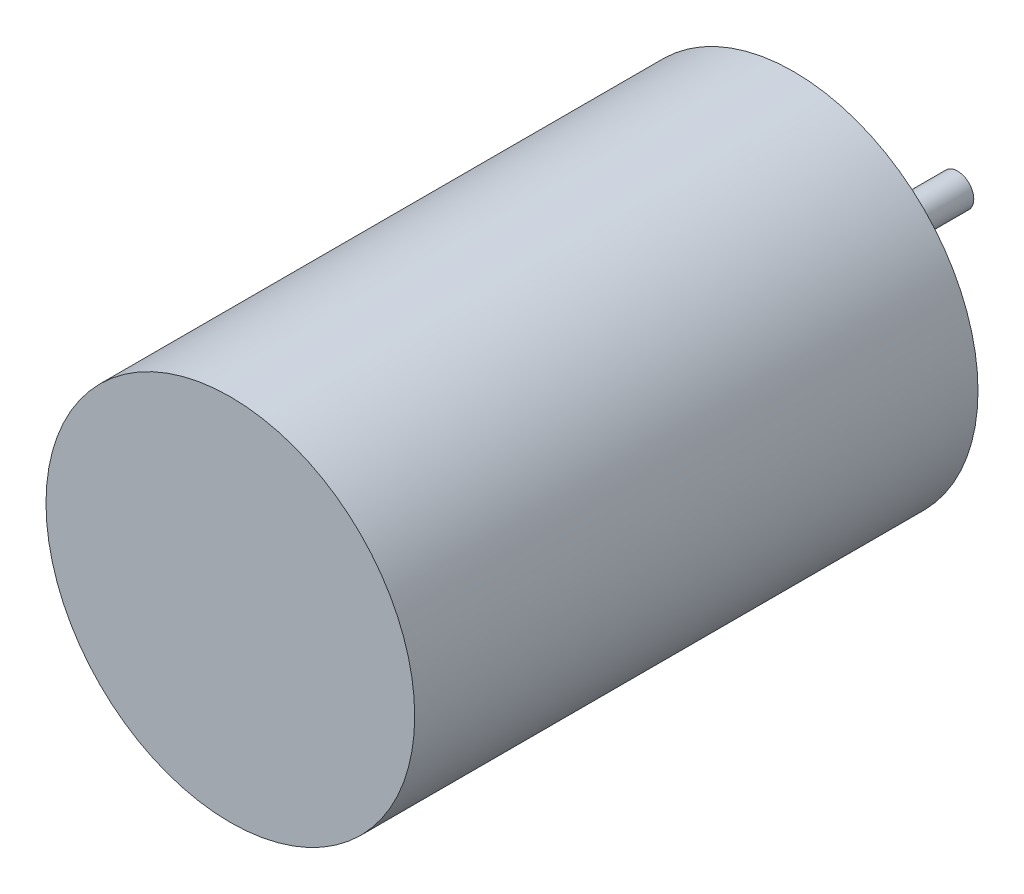
ISO-10303-21;
HEADER;
FILE_DESCRIPTION(('STEP AP214'),'2;1');
FILE_NAME('part.step','',(''),(''),'','','');
FILE_SCHEMA(('AUTOMOTIVE_DESIGN { 1 0 10303 214 1 1 1 1 }'));
ENDSEC;
DATA;
#1=APPLICATION_CONTEXT('core data for automotive mechanical design processes');
#2=APPLICATION_PROTOCOL_DEFINITION('international standard','automotive_design',2000,#1);
#3=PRODUCT_CONTEXT('',#1,'mechanical');
#4=PRODUCT('Part','Part','',(#3));
#5=PRODUCT_RELATED_PRODUCT_CATEGORY('part','',(#4));
#6=PRODUCT_DEFINITION_FORMATION('','',#4);
#7=PRODUCT_DEFINITION_CONTEXT('part definition',#1,'design');
#8=PRODUCT_DEFINITION('design','',#6,#7);
#9=PRODUCT_DEFINITION_SHAPE('','',#8);
#10=(LENGTH_UNIT() NAMED_UNIT(*) SI_UNIT(.MILLI.,.METRE.));
#11=(NAMED_UNIT(*) PLANE_ANGLE_UNIT() SI_UNIT($,.RADIAN.));
#12=(NAMED_UNIT(*) SI_UNIT($,.STERADIAN.) SOLID_ANGLE_UNIT());
#13=UNCERTAINTY_MEASURE_WITH_UNIT(LENGTH_MEASURE(1.E-05),#10,'distance_accuracy_value','');
#14=(GEOMETRIC_REPRESENTATION_CONTEXT(3) GLOBAL_UNCERTAINTY_ASSIGNED_CONTEXT((#13)) GLOBAL_UNIT_ASSIGNED_CONTEXT((#10,
#11,#12)) REPRESENTATION_CONTEXT('',''));
#15=CARTESIAN_POINT('',(0.,0.,0.));
#16=DIRECTION('',(0.,0.,1.));
#17=DIRECTION('',(1.,0.,0.));
#18=AXIS2_PLACEMENT_3D('',#15,#16,#17);
#19=CARTESIAN_POINT('',(0.,0.,0.));
#20=DIRECTION('',(0.,0.,1.));
#21=DIRECTION('',(1.,0.,0.));
#22=AXIS2_PLACEMENT_3D('',#19,#20,#21);
#23=PLANE('',#22);
#24=CARTESIAN_POINT('',(0.,0.,0.));
#25=DIRECTION('',(0.,0.,1.));
#26=DIRECTION('',(1.,0.,0.));
#27=AXIS2_PLACEMENT_3D('',#24,#25,#26);
#28=CIRCLE('',#27,18.);
#29=CARTESIAN_POINT('',(18.,0.,0.));
#30=VERTEX_POINT('',#29);
#31=EDGE_CURVE('E42',#30,#30,#28,.T.);
#32=ORIENTED_EDGE('',*,*,#31,.F.);
#33=EDGE_LOOP('',(#32));
#34=FACE_BOUND('',#33,.T.);
#35=CARTESIAN_POINT('',(0.,0.,0.));
#36=DIRECTION('',(0.,0.,1.));
#37=DIRECTION('',(1.,0.,0.));
#38=AXIS2_PLACEMENT_3D('',#35,#36,#37);
#39=CIRCLE('',#38,1.5875);
#40=CARTESIAN_POINT('',(1.5875,0.,0.));
#41=VERTEX_POINT('',#40);
#42=EDGE_CURVE('E10',#41,#41,#39,.F.);
#43=ORIENTED_EDGE('',*,*,#42,.F.);
#44=EDGE_LOOP('',(#43));
#45=FACE_BOUND('',#44,.T.);
#46=ADVANCED_FACE('F31',(#34,#45),#23,.F.);
#47=CARTESIAN_POINT('',(0.,0.,55.));
#48=DIRECTION('',(0.,0.,-1.));
#49=DIRECTION('',(-1.,0.,0.));
#50=AXIS2_PLACEMENT_3D('',#47,#48,#49);
#51=CYLINDRICAL_SURFACE('',#50,18.);
#52=CARTESIAN_POINT('',(0.,0.,55.));
#53=DIRECTION('',(0.,0.,1.));
#54=DIRECTION('',(1.,0.,0.));
#55=AXIS2_PLACEMENT_3D('',#52,#53,#54);
#56=CIRCLE('',#55,18.);
#57=CARTESIAN_POINT('',(18.,0.,55.));
#58=VERTEX_POINT('',#57);
#59=EDGE_CURVE('E38',#58,#58,#56,.T.);
#60=ORIENTED_EDGE('',*,*,#59,.F.);
#61=EDGE_LOOP('',(#60));
#62=FACE_BOUND('',#61,.T.);
#63=ORIENTED_EDGE('',*,*,#31,.T.);
#64=EDGE_LOOP('',(#63));
#65=FACE_BOUND('',#64,.T.);
#66=ADVANCED_FACE('F33',(#62,#65),#51,.T.);
#67=CARTESIAN_POINT('',(0.,0.,55.));
#68=DIRECTION('',(0.,0.,1.));
#69=DIRECTION('',(1.,0.,0.));
#70=AXIS2_PLACEMENT_3D('',#67,#68,#69);
#71=PLANE('',#70);
#72=ORIENTED_EDGE('',*,*,#59,.T.);
#73=EDGE_LOOP('',(#72));
#74=FACE_BOUND('',#73,.T.);
#75=ADVANCED_FACE('F56',(#74),#71,.T.);
#76=CARTESIAN_POINT('',(0.,0.,-16.));
#77=DIRECTION('',(0.,0.,1.));
#78=DIRECTION('',(1.,0.,0.));
#79=AXIS2_PLACEMENT_3D('',#76,#77,#78);
#80=CYLINDRICAL_SURFACE('',#79,1.5875);
#81=CARTESIAN_POINT('',(0.,0.,-16.));
#82=DIRECTION('',(0.,0.,-1.));
#83=DIRECTION('',(-1.,0.,0.));
#84=AXIS2_PLACEMENT_3D('',#81,#82,#83);
#85=CIRCLE('',#84,1.5875);
#86=CARTESIAN_POINT('',(-1.5875,0.,-16.));
#87=VERTEX_POINT('',#86);
#88=EDGE_CURVE('E47',#87,#87,#85,.T.);
#89=ORIENTED_EDGE('',*,*,#88,.F.);
#90=EDGE_LOOP('',(#89));
#91=FACE_BOUND('',#90,.T.);
#92=ORIENTED_EDGE('',*,*,#42,.T.);
#93=EDGE_LOOP('',(#92));
#94=FACE_BOUND('',#93,.T.);
#95=ADVANCED_FACE('F54',(#91,#94),#80,.T.);
#96=CARTESIAN_POINT('',(0.,0.,-16.));
#97=DIRECTION('',(0.,0.,-1.));
#98=DIRECTION('',(-1.,0.,0.));
#99=AXIS2_PLACEMENT_3D('',#96,#97,#98);
#100=PLANE('',#99);
#101=ORIENTED_EDGE('',*,*,#88,.T.);
#102=EDGE_LOOP('',(#101));
#103=FACE_BOUND('',#102,.T.);
#104=ADVANCED_FACE('F52',(#103),#100,.T.);
#105=CLOSED_SHELL('',(#46,#66,#75,#95,#104));
#106=MANIFOLD_SOLID_BREP('B2',#105);
#107=ADVANCED_BREP_SHAPE_REPRESENTATION('',(#18,#106),#14);
#108=SHAPE_DEFINITION_REPRESENTATION(#9,#107);
ENDSEC;
END-ISO-10303-21;
